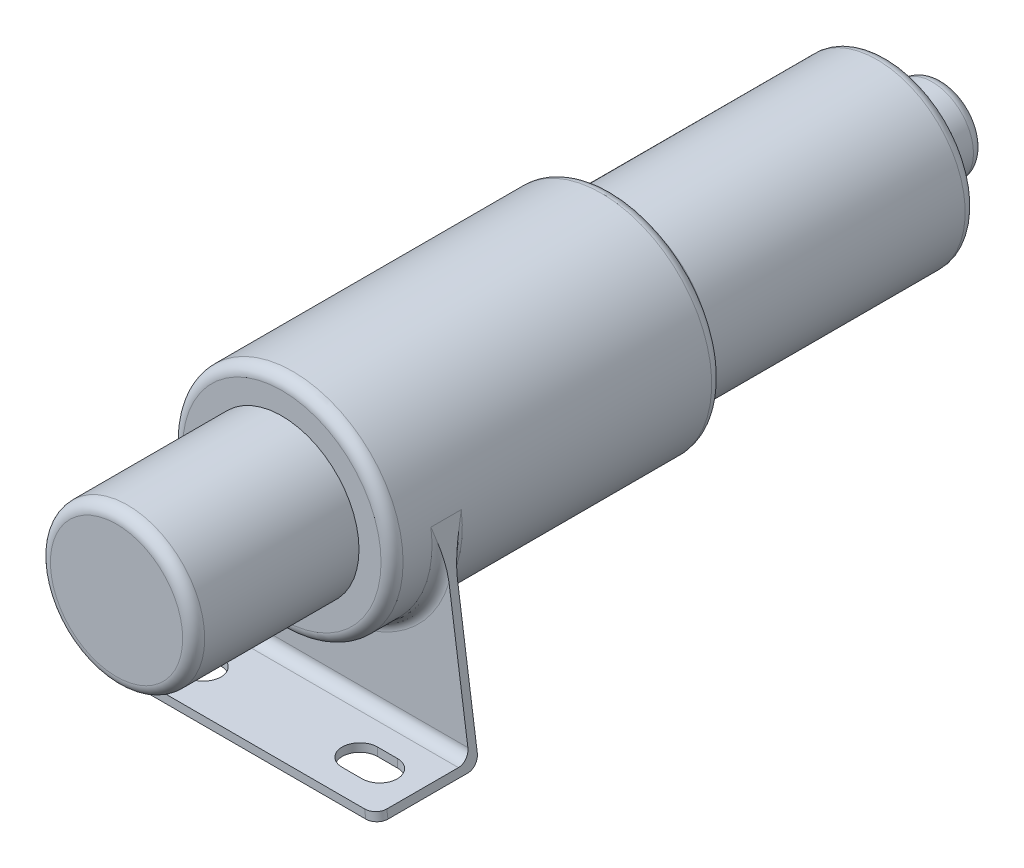
ISO-10303-21;
HEADER;
FILE_DESCRIPTION(('STEP AP214'),'2;1');
FILE_NAME('part.step','',(''),(''),'','','');
FILE_SCHEMA(('AUTOMOTIVE_DESIGN { 1 0 10303 214 1 1 1 1 }'));
ENDSEC;
DATA;
#1=APPLICATION_CONTEXT('core data for automotive mechanical design processes');
#2=APPLICATION_PROTOCOL_DEFINITION('international standard','automotive_design',2000,#1);
#3=PRODUCT_CONTEXT('',#1,'mechanical');
#4=PRODUCT('Part','Part','',(#3));
#5=PRODUCT_RELATED_PRODUCT_CATEGORY('part','',(#4));
#6=PRODUCT_DEFINITION_FORMATION('','',#4);
#7=PRODUCT_DEFINITION_CONTEXT('part definition',#1,'design');
#8=PRODUCT_DEFINITION('design','',#6,#7);
#9=PRODUCT_DEFINITION_SHAPE('','',#8);
#10=(LENGTH_UNIT() NAMED_UNIT(*) SI_UNIT(.MILLI.,.METRE.));
#11=(NAMED_UNIT(*) PLANE_ANGLE_UNIT() SI_UNIT($,.RADIAN.));
#12=(NAMED_UNIT(*) SI_UNIT($,.STERADIAN.) SOLID_ANGLE_UNIT());
#13=UNCERTAINTY_MEASURE_WITH_UNIT(LENGTH_MEASURE(1.E-05),#10,'distance_accuracy_value','');
#14=(GEOMETRIC_REPRESENTATION_CONTEXT(3) GLOBAL_UNCERTAINTY_ASSIGNED_CONTEXT((#13)) GLOBAL_UNIT_ASSIGNED_CONTEXT((#10,
#11,#12)) REPRESENTATION_CONTEXT('',''));
#15=CARTESIAN_POINT('',(0.,0.,0.));
#16=DIRECTION('',(0.,0.,1.));
#17=DIRECTION('',(1.,0.,0.));
#18=AXIS2_PLACEMENT_3D('',#15,#16,#17);
#19=CARTESIAN_POINT('',(0.,0.,75.));
#20=DIRECTION('',(0.,0.,-1.));
#21=DIRECTION('',(-1.,0.,0.));
#22=AXIS2_PLACEMENT_3D('',#19,#20,#21);
#23=CYLINDRICAL_SURFACE('',#22,20.);
#24=CARTESIAN_POINT('',(0.,0.,43.));
#25=DIRECTION('',(0.,0.,1.));
#26=DIRECTION('',(1.,0.,0.));
#27=AXIS2_PLACEMENT_3D('',#24,#25,#26);
#28=CIRCLE('',#27,20.);
#29=CARTESIAN_POINT('',(20.,0.,43.));
#30=VERTEX_POINT('',#29);
#31=EDGE_CURVE('E293',#30,#30,#28,.F.);
#32=ORIENTED_EDGE('',*,*,#31,.T.);
#33=EDGE_LOOP('',(#32));
#34=FACE_BOUND('',#33,.T.);
#35=CARTESIAN_POINT('',(0.,0.,-13.));
#36=DIRECTION('',(0.,0.,-1.));
#37=DIRECTION('',(-1.,0.,0.));
#38=AXIS2_PLACEMENT_3D('',#35,#36,#37);
#39=CIRCLE('',#38,20.);
#40=CARTESIAN_POINT('',(-20.,0.,-13.));
#41=VERTEX_POINT('',#40);
#42=EDGE_CURVE('E290',#41,#41,#39,.F.);
#43=ORIENTED_EDGE('',*,*,#42,.T.);
#44=EDGE_LOOP('',(#43));
#45=FACE_BOUND('',#44,.T.);
#46=CARTESIAN_POINT('',(0.,0.,32.25));
#47=DIRECTION('',(0.,0.,1.));
#48=DIRECTION('',(1.,0.,0.));
#49=AXIS2_PLACEMENT_3D('',#46,#47,#48);
#50=CIRCLE('',#49,20.);
#51=CARTESIAN_POINT('',(19.8034978548256,2.79668959913647,32.25));
#52=VERTEX_POINT('',#51);
#53=CARTESIAN_POINT('',(-19.8034978548256,2.79668959913647,32.25));
#54=VERTEX_POINT('',#53);
#55=EDGE_CURVE('E299',#52,#54,#50,.F.);
#56=ORIENTED_EDGE('',*,*,#55,.T.);
#57=DIRECTION('',(0.,0.,1.));
#58=VECTOR('',#57,1.);
#59=CARTESIAN_POINT('',(-19.8034978548256,2.79668959913647,34.25));
#60=LINE('',#59,#58);
#61=CARTESIAN_POINT('',(-19.8034978548256,2.79668959913647,37.75));
#62=VERTEX_POINT('',#61);
#63=EDGE_CURVE('E267',#54,#62,#60,.T.);
#64=ORIENTED_EDGE('',*,*,#63,.T.);
#65=CARTESIAN_POINT('',(0.,0.,37.75));
#66=DIRECTION('',(0.,0.,1.));
#67=DIRECTION('',(1.,0.,0.));
#68=AXIS2_PLACEMENT_3D('',#65,#66,#67);
#69=CIRCLE('',#68,20.);
#70=CARTESIAN_POINT('',(19.8034978548256,2.79668959913647,37.75));
#71=VERTEX_POINT('',#70);
#72=EDGE_CURVE('E296',#62,#71,#69,.T.);
#73=ORIENTED_EDGE('',*,*,#72,.T.);
#74=DIRECTION('',(0.,0.,1.));
#75=VECTOR('',#74,1.);
#76=CARTESIAN_POINT('',(19.8034978548256,2.79668959913647,34.25));
#77=LINE('',#76,#75);
#78=EDGE_CURVE('E272',#52,#71,#77,.T.);
#79=ORIENTED_EDGE('',*,*,#78,.F.);
#80=EDGE_LOOP('',(#56,#64,#73,#79));
#81=FACE_BOUND('',#80,.T.);
#82=ADVANCED_FACE('F39',(#34,#45,#81),#23,.T.);
#83=CARTESIAN_POINT('',(0.,0.,35.75));
#84=DIRECTION('',(0.,0.,1.));
#85=DIRECTION('',(1.,0.,0.));
#86=AXIS2_PLACEMENT_3D('',#83,#84,#85);
#87=PLANE('',#86);
#88=DIRECTION('',(-0.139834479956823,0.99017489274128,0.));
#89=VECTOR('',#88,1.);
#90=CARTESIAN_POINT('',(19.8034978548256,2.79668959913647,35.75));
#91=LINE('',#90,#89);
#92=CARTESIAN_POINT('',(24.505722995567,-30.5,35.75));
#93=VERTEX_POINT('',#92);
#94=CARTESIAN_POINT('',(21.0851020331594,-6.27841319532692,35.75));
#95=VERTEX_POINT('',#94);
#96=EDGE_CURVE('E264',#93,#95,#91,.T.);
#97=ORIENTED_EDGE('',*,*,#96,.T.);
#98=CARTESIAN_POINT('',(0.,0.,35.75));
#99=DIRECTION('',(0.,0.,1.));
#100=DIRECTION('',(1.,0.,0.));
#101=AXIS2_PLACEMENT_3D('',#98,#99,#100);
#102=CIRCLE('',#101,22.);
#103=CARTESIAN_POINT('',(-21.0851020331594,-6.27841319532692,35.75));
#104=VERTEX_POINT('',#103);
#105=EDGE_CURVE('E308',#95,#104,#102,.F.);
#106=ORIENTED_EDGE('',*,*,#105,.T.);
#107=DIRECTION('',(-0.139834479956823,-0.99017489274128,0.));
#108=VECTOR('',#107,1.);
#109=CARTESIAN_POINT('',(-19.8034978548256,2.79668959913647,35.75));
#110=LINE('',#109,#108);
#111=CARTESIAN_POINT('',(-24.505722995567,-30.5,35.75));
#112=VERTEX_POINT('',#111);
#113=EDGE_CURVE('E259',#104,#112,#110,.T.);
#114=ORIENTED_EDGE('',*,*,#113,.T.);
#115=DIRECTION('',(-1.,0.,0.));
#116=VECTOR('',#115,1.);
#117=CARTESIAN_POINT('',(0.,-30.5,35.75));
#118=LINE('',#117,#116);
#119=EDGE_CURVE('E306',#112,#93,#118,.F.);
#120=ORIENTED_EDGE('',*,*,#119,.T.);
#121=EDGE_LOOP('',(#97,#106,#114,#120));
#122=FACE_BOUND('',#121,.T.);
#123=ADVANCED_FACE('F414',(#122),#87,.T.);
#124=CARTESIAN_POINT('',(0.,0.,45.));
#125=DIRECTION('',(0.,0.,1.));
#126=DIRECTION('',(1.,0.,0.));
#127=AXIS2_PLACEMENT_3D('',#124,#125,#126);
#128=PLANE('',#127);
#129=CARTESIAN_POINT('',(0.,0.,45.));
#130=DIRECTION('',(0.,0.,1.));
#131=DIRECTION('',(1.,0.,0.));
#132=AXIS2_PLACEMENT_3D('',#129,#130,#131);
#133=CIRCLE('',#132,18.);
#134=CARTESIAN_POINT('',(18.,0.,45.));
#135=VERTEX_POINT('',#134);
#136=EDGE_CURVE('E336',#135,#135,#133,.T.);
#137=ORIENTED_EDGE('',*,*,#136,.T.);
#138=EDGE_LOOP('',(#137));
#139=FACE_BOUND('',#138,.T.);
#140=CARTESIAN_POINT('',(0.,0.,45.));
#141=DIRECTION('',(0.,0.,1.));
#142=DIRECTION('',(1.,0.,0.));
#143=AXIS2_PLACEMENT_3D('',#140,#141,#142);
#144=CIRCLE('',#143,14.);
#145=CARTESIAN_POINT('',(14.,0.,45.));
#146=VERTEX_POINT('',#145);
#147=EDGE_CURVE('E274',#146,#146,#144,.T.);
#148=ORIENTED_EDGE('',*,*,#147,.F.);
#149=EDGE_LOOP('',(#148));
#150=FACE_BOUND('',#149,.T.);
#151=ADVANCED_FACE('F429',(#139,#150),#128,.T.);
#152=CARTESIAN_POINT('',(0.,0.,45.));
#153=DIRECTION('',(0.,0.,1.));
#154=DIRECTION('',(1.,0.,0.));
#155=AXIS2_PLACEMENT_3D('',#152,#153,#154);
#156=CYLINDRICAL_SURFACE('',#155,14.);
#157=CARTESIAN_POINT('',(0.,0.,73.));
#158=DIRECTION('',(0.,0.,1.));
#159=DIRECTION('',(1.,0.,0.));
#160=AXIS2_PLACEMENT_3D('',#157,#158,#159);
#161=CIRCLE('',#160,14.);
#162=CARTESIAN_POINT('',(14.,0.,73.));
#163=VERTEX_POINT('',#162);
#164=EDGE_CURVE('E287',#163,#163,#161,.F.);
#165=ORIENTED_EDGE('',*,*,#164,.T.);
#166=EDGE_LOOP('',(#165));
#167=FACE_BOUND('',#166,.T.);
#168=ORIENTED_EDGE('',*,*,#147,.T.);
#169=EDGE_LOOP('',(#168));
#170=FACE_BOUND('',#169,.T.);
#171=ADVANCED_FACE('F440',(#167,#170),#156,.T.);
#172=CARTESIAN_POINT('',(0.,0.,75.));
#173=DIRECTION('',(0.,0.,1.));
#174=DIRECTION('',(1.,0.,0.));
#175=AXIS2_PLACEMENT_3D('',#172,#173,#174);
#176=PLANE('',#175);
#177=CARTESIAN_POINT('',(0.,0.,75.));
#178=DIRECTION('',(0.,0.,1.));
#179=DIRECTION('',(1.,0.,0.));
#180=AXIS2_PLACEMENT_3D('',#177,#178,#179);
#181=CIRCLE('',#180,12.);
#182=CARTESIAN_POINT('',(12.,0.,75.));
#183=VERTEX_POINT('',#182);
#184=EDGE_CURVE('E284',#183,#183,#181,.T.);
#185=ORIENTED_EDGE('',*,*,#184,.T.);
#186=EDGE_LOOP('',(#185));
#187=FACE_BOUND('',#186,.T.);
#188=ADVANCED_FACE('F412',(#187),#176,.T.);
#189=CARTESIAN_POINT('',(19.8034978548256,2.79668959913647,34.25));
#190=DIRECTION('',(0.99017489274128,0.139834479956823,0.));
#191=DIRECTION('',(-0.139834479956823,0.99017489274128,0.));
#192=AXIS2_PLACEMENT_3D('',#189,#190,#191);
#193=PLANE('',#192);
#194=DIRECTION('',(0.,0.,1.));
#195=VECTOR('',#194,1.);
#196=CARTESIAN_POINT('',(25.,-34.,34.25));
#197=LINE('',#196,#195);
#198=CARTESIAN_POINT('',(25.,-34.,36.25));
#199=VERTEX_POINT('',#198);
#200=CARTESIAN_POINT('',(25.,-34.,50.75));
#201=VERTEX_POINT('',#200);
#202=EDGE_CURVE('E275',#199,#201,#197,.T.);
#203=ORIENTED_EDGE('',*,*,#202,.F.);
#204=CARTESIAN_POINT('',(24.7175559974669,-32.,36.25));
#205=DIRECTION('',(0.99017489274128,0.139834479956823,0.));
#206=DIRECTION('',(-0.139834479956823,0.99017489274128,0.));
#207=AXIS2_PLACEMENT_3D('',#204,#205,#206);
#208=ELLIPSE('',#207,2.0198451956937,2.);
#209=CARTESIAN_POINT('',(24.7175559974669,-32.,34.25));
#210=VERTEX_POINT('',#209);
#211=EDGE_CURVE('E320',#199,#210,#208,.T.);
#212=ORIENTED_EDGE('',*,*,#211,.T.);
#213=DIRECTION('',(-0.139834479956823,0.99017489274128,0.));
#214=VECTOR('',#213,1.);
#215=CARTESIAN_POINT('',(19.8034978548256,2.79668959913647,34.25));
#216=LINE('',#215,#214);
#217=CARTESIAN_POINT('',(21.0851020331594,-6.27841319532692,34.25));
#218=VERTEX_POINT('',#217);
#219=EDGE_CURVE('E263',#210,#218,#216,.T.);
#220=ORIENTED_EDGE('',*,*,#219,.T.);
#221=CARTESIAN_POINT('',(21.0851020331595,-6.27841319532692,34.25));
#222=CARTESIAN_POINT('',(21.0614469380755,-6.11091029300459,34.2499729997001));
#223=CARTESIAN_POINT('',(21.0377968763078,-5.94344303184393,34.2462763573336));
#224=CARTESIAN_POINT('',(20.9905423514377,-5.60883139593561,34.2323570233018));
#225=CARTESIAN_POINT('',(20.9669378747328,-5.44168692486708,34.2221367395415));
#226=CARTESIAN_POINT('',(20.9198318154485,-5.10812658114009,34.1960039183706));
#227=CARTESIAN_POINT('',(20.8963301269804,-4.94170995867766,34.1801008885507));
#228=CARTESIAN_POINT('',(20.8494028226245,-4.60941538747097,34.1432473207556));
#229=CARTESIAN_POINT('',(20.8259772148835,-4.44353749641365,34.1222962592003));
#230=CARTESIAN_POINT('',(20.7561100180994,-3.94880440838519,34.0530275118771));
#231=CARTESIAN_POINT('',(20.7097952126454,-3.62084697230123,33.9981227378503));
#232=CARTESIAN_POINT('',(20.6175168163215,-2.96741906803518,33.8743949838894));
#233=CARTESIAN_POINT('',(20.5715534119472,-2.6419499204372,33.8055650826625));
#234=CARTESIAN_POINT('',(20.4650530812598,-1.88781579308973,33.6328054875952));
#235=CARTESIAN_POINT('',(20.4046481189218,-1.460085256798,33.5247470379304));
#236=CARTESIAN_POINT('',(20.2843352860557,-0.608144115990681,33.2952243848944));
#237=CARTESIAN_POINT('',(20.2244275171678,-0.183934231195236,33.1737575096745));
#238=CARTESIAN_POINT('',(20.0450735376402,1.08608019941085,32.7962493124458));
#239=CARTESIAN_POINT('',(19.9261627835343,1.92809315093056,32.5273991714335));
#240=CARTESIAN_POINT('',(19.806011890775,2.77888758580355,32.2556853351513));
#241=CARTESIAN_POINT('',(19.8047548722683,2.78778859623721,32.2528426586804));
#242=CARTESIAN_POINT('',(19.8034978548256,2.79668959913647,32.25));
#243=B_SPLINE_CURVE_WITH_KNOTS('',3,(#221,#222,#223,#224,#225,#226,#227,#228,#229,#230,#231,
#232,#233,#234,#235,#236,#237,#238,#239,#240,#241,#242),.UNSPECIFIED.,.F.,.F.,(4,2,2,2,2,2,2,2,
2,2,4),(0.,0.507403542069386,1.01461990746108,1.52099161098803,2.02741585785029,3.0341830537536,
4.0414518842608,5.37696765157115,6.71275002434702,9.38798628326188,9.41627055450936),.UNSPECIFIED.);
#244=EDGE_CURVE('E368',#218,#52,#243,.T.);
#245=ORIENTED_EDGE('',*,*,#244,.T.);
#246=ORIENTED_EDGE('',*,*,#78,.T.);
#247=CARTESIAN_POINT('',(21.0851020331595,-6.27841319532692,35.75));
#248=CARTESIAN_POINT('',(21.0614469380755,-6.11091029300459,35.7500270002999));
#249=CARTESIAN_POINT('',(21.0377968763078,-5.94344303184393,35.7537236426664));
#250=CARTESIAN_POINT('',(20.9905423514377,-5.60883139593561,35.7676429766982));
#251=CARTESIAN_POINT('',(20.9669378747328,-5.44168692486708,35.7778632604585));
#252=CARTESIAN_POINT('',(20.9198318154485,-5.10812658114009,35.8039960816294));
#253=CARTESIAN_POINT('',(20.8963301269804,-4.94170995867766,35.8198991114493));
#254=CARTESIAN_POINT('',(20.8494028226245,-4.60941538747097,35.8567526792444));
#255=CARTESIAN_POINT('',(20.8259772148835,-4.44353749641365,35.8777037407997));
#256=CARTESIAN_POINT('',(20.7561100180994,-3.94880440838519,35.9469724881229));
#257=CARTESIAN_POINT('',(20.7097952126454,-3.62084697230123,36.0018772621497));
#258=CARTESIAN_POINT('',(20.6175168163215,-2.96741906803518,36.1256050161106));
#259=CARTESIAN_POINT('',(20.5715534119472,-2.6419499204372,36.1944349173375));
#260=CARTESIAN_POINT('',(20.4650530812598,-1.88781579308973,36.3671945124048));
#261=CARTESIAN_POINT('',(20.4046481189218,-1.46008525679801,36.4752529620696));
#262=CARTESIAN_POINT('',(20.2843352860557,-0.608144115990683,36.7047756151056));
#263=CARTESIAN_POINT('',(20.2244275171678,-0.183934231195239,36.8262424903255));
#264=CARTESIAN_POINT('',(20.0450735376402,1.08608019941084,37.2037506875542));
#265=CARTESIAN_POINT('',(19.9261627835343,1.92809315093056,37.4726008285665));
#266=CARTESIAN_POINT('',(19.806011890775,2.77888758580355,37.7443146648487));
#267=CARTESIAN_POINT('',(19.8047548722683,2.78778859623721,37.7471573413196));
#268=CARTESIAN_POINT('',(19.8034978548256,2.79668959913647,37.75));
#269=B_SPLINE_CURVE_WITH_KNOTS('',3,(#247,#248,#249,#250,#251,#252,#253,#254,#255,#256,#257,
#258,#259,#260,#261,#262,#263,#264,#265,#266,#267,#268),.UNSPECIFIED.,.F.,.F.,(4,2,2,2,2,2,2,2,
2,2,4),(0.,0.507403542069386,1.01461990746108,1.52099161098803,2.02741585785029,3.0341830537536,
4.0414518842608,5.37696765157115,6.71275002434702,9.38798628326188,9.41627055450936),.UNSPECIFIED.);
#270=EDGE_CURVE('E402',#71,#95,#269,.F.);
#271=ORIENTED_EDGE('',*,*,#270,.T.);
#272=ORIENTED_EDGE('',*,*,#96,.F.);
#273=CARTESIAN_POINT('',(24.5057229955671,-30.5,37.75));
#274=DIRECTION('',(0.99017489274128,0.139834479956823,0.));
#275=DIRECTION('',(-0.139834479956823,0.99017489274128,0.));
#276=AXIS2_PLACEMENT_3D('',#273,#274,#275);
#277=ELLIPSE('',#276,2.0198451956937,2.);
#278=CARTESIAN_POINT('',(24.7881669981002,-32.5,37.75));
#279=VERTEX_POINT('',#278);
#280=EDGE_CURVE('E11',#93,#279,#277,.F.);
#281=ORIENTED_EDGE('',*,*,#280,.T.);
#282=DIRECTION('',(0.,0.,-1.));
#283=VECTOR('',#282,1.);
#284=CARTESIAN_POINT('',(24.7881669981002,-32.5,52.75));
#285=LINE('',#284,#283);
#286=CARTESIAN_POINT('',(24.7881669981002,-32.5,50.75));
#287=VERTEX_POINT('',#286);
#288=EDGE_CURVE('E256',#287,#279,#285,.T.);
#289=ORIENTED_EDGE('',*,*,#288,.F.);
#290=DIRECTION('',(-0.139834479956823,0.99017489274128,0.));
#291=VECTOR('',#290,1.);
#292=CARTESIAN_POINT('',(25.,-34.,50.75));
#293=LINE('',#292,#291);
#294=EDGE_CURVE('E318',#287,#201,#293,.F.);
#295=ORIENTED_EDGE('',*,*,#294,.T.);
#296=EDGE_LOOP('',(#203,#212,#220,#245,#246,#271,#272,#281,#289,#295));
#297=FACE_BOUND('',#296,.T.);
#298=ADVANCED_FACE('F408',(#297),#193,.T.);
#299=CARTESIAN_POINT('',(25.,-34.,34.25));
#300=DIRECTION('',(0.,-1.,0.));
#301=DIRECTION('',(0.,0.,-1.));
#302=AXIS2_PLACEMENT_3D('',#299,#300,#301);
#303=PLANE('',#302);
#304=DIRECTION('',(1.,0.,0.));
#305=VECTOR('',#304,1.);
#306=CARTESIAN_POINT('',(-17.8,-34.,41.85));
#307=LINE('',#306,#305);
#308=CARTESIAN_POINT('',(-17.8,-34.,41.85));
#309=VERTEX_POINT('',#308);
#310=CARTESIAN_POINT('',(-14.2,-34.,41.85));
#311=VERTEX_POINT('',#310);
#312=EDGE_CURVE('E183',#309,#311,#307,.T.);
#313=ORIENTED_EDGE('',*,*,#312,.F.);
#314=CARTESIAN_POINT('',(-17.8,-34.,45.05));
#315=DIRECTION('',(0.,-1.,0.));
#316=DIRECTION('',(0.,0.,-1.));
#317=AXIS2_PLACEMENT_3D('',#314,#315,#316);
#318=CIRCLE('',#317,3.2);
#319=CARTESIAN_POINT('',(-17.8,-34.,48.25));
#320=VERTEX_POINT('',#319);
#321=EDGE_CURVE('E195',#320,#309,#318,.T.);
#322=ORIENTED_EDGE('',*,*,#321,.F.);
#323=DIRECTION('',(-1.,0.,0.));
#324=VECTOR('',#323,1.);
#325=CARTESIAN_POINT('',(-17.8,-34.,48.25));
#326=LINE('',#325,#324);
#327=CARTESIAN_POINT('',(-14.2,-34.,48.25));
#328=VERTEX_POINT('',#327);
#329=EDGE_CURVE('E191',#328,#320,#326,.T.);
#330=ORIENTED_EDGE('',*,*,#329,.F.);
#331=CARTESIAN_POINT('',(-14.2,-34.,45.05));
#332=DIRECTION('',(0.,-1.,0.));
#333=DIRECTION('',(0.,0.,-1.));
#334=AXIS2_PLACEMENT_3D('',#331,#332,#333);
#335=CIRCLE('',#334,3.2);
#336=EDGE_CURVE('E205',#311,#328,#335,.T.);
#337=ORIENTED_EDGE('',*,*,#336,.F.);
#338=EDGE_LOOP('',(#313,#322,#330,#337));
#339=FACE_BOUND('',#338,.T.);
#340=CARTESIAN_POINT('',(17.8,-34.,45.05));
#341=DIRECTION('',(0.,-1.,0.));
#342=DIRECTION('',(0.,0.,1.));
#343=AXIS2_PLACEMENT_3D('',#340,#341,#342);
#344=CIRCLE('',#343,3.2);
#345=CARTESIAN_POINT('',(17.8,-34.,41.85));
#346=VERTEX_POINT('',#345);
#347=CARTESIAN_POINT('',(17.8,-34.,48.25));
#348=VERTEX_POINT('',#347);
#349=EDGE_CURVE('E232',#346,#348,#344,.T.);
#350=ORIENTED_EDGE('',*,*,#349,.F.);
#351=DIRECTION('',(1.,0.,0.));
#352=VECTOR('',#351,1.);
#353=CARTESIAN_POINT('',(17.8,-34.,41.85));
#354=LINE('',#353,#352);
#355=CARTESIAN_POINT('',(14.2,-34.,41.85));
#356=VERTEX_POINT('',#355);
#357=EDGE_CURVE('E240',#356,#346,#354,.T.);
#358=ORIENTED_EDGE('',*,*,#357,.F.);
#359=CARTESIAN_POINT('',(14.2,-34.,45.05));
#360=DIRECTION('',(0.,-1.,0.));
#361=DIRECTION('',(0.,0.,1.));
#362=AXIS2_PLACEMENT_3D('',#359,#360,#361);
#363=CIRCLE('',#362,3.2);
#364=CARTESIAN_POINT('',(14.2,-34.,48.25));
#365=VERTEX_POINT('',#364);
#366=EDGE_CURVE('E237',#365,#356,#363,.T.);
#367=ORIENTED_EDGE('',*,*,#366,.F.);
#368=DIRECTION('',(-1.,0.,0.));
#369=VECTOR('',#368,1.);
#370=CARTESIAN_POINT('',(17.8,-34.,48.25));
#371=LINE('',#370,#369);
#372=EDGE_CURVE('E234',#348,#365,#371,.T.);
#373=ORIENTED_EDGE('',*,*,#372,.F.);
#374=EDGE_LOOP('',(#350,#358,#367,#373));
#375=FACE_BOUND('',#374,.T.);
#376=DIRECTION('',(0.,0.,1.));
#377=VECTOR('',#376,1.);
#378=CARTESIAN_POINT('',(-25.,-34.,34.25));
#379=LINE('',#378,#377);
#380=CARTESIAN_POINT('',(-25.,-34.,36.25));
#381=VERTEX_POINT('',#380);
#382=CARTESIAN_POINT('',(-25.,-34.,50.75));
#383=VERTEX_POINT('',#382);
#384=EDGE_CURVE('E278',#381,#383,#379,.T.);
#385=ORIENTED_EDGE('',*,*,#384,.F.);
#386=DIRECTION('',(1.,0.,0.));
#387=VECTOR('',#386,1.);
#388=CARTESIAN_POINT('',(25.,-34.,36.25));
#389=LINE('',#388,#387);
#390=EDGE_CURVE('E315',#381,#199,#389,.T.);
#391=ORIENTED_EDGE('',*,*,#390,.T.);
#392=ORIENTED_EDGE('',*,*,#202,.T.);
#393=CARTESIAN_POINT('',(22.9801548043063,-34.,50.75));
#394=DIRECTION('',(0.,-1.,0.));
#395=DIRECTION('',(1.,0.,0.));
#396=AXIS2_PLACEMENT_3D('',#393,#394,#395);
#397=ELLIPSE('',#396,2.0198451956937,2.);
#398=CARTESIAN_POINT('',(22.9801548043063,-34.,52.75));
#399=VERTEX_POINT('',#398);
#400=EDGE_CURVE('E311',#201,#399,#397,.T.);
#401=ORIENTED_EDGE('',*,*,#400,.T.);
#402=DIRECTION('',(1.,0.,0.));
#403=VECTOR('',#402,1.);
#404=CARTESIAN_POINT('',(25.,-34.,52.75));
#405=LINE('',#404,#403);
#406=CARTESIAN_POINT('',(-22.9801548043063,-34.,52.75));
#407=VERTEX_POINT('',#406);
#408=EDGE_CURVE('E216',#407,#399,#405,.T.);
#409=ORIENTED_EDGE('',*,*,#408,.F.);
#410=CARTESIAN_POINT('',(-22.9801548043063,-34.,50.75));
#411=DIRECTION('',(0.,-1.,0.));
#412=DIRECTION('',(1.,0.,0.));
#413=AXIS2_PLACEMENT_3D('',#410,#411,#412);
#414=ELLIPSE('',#413,2.0198451956937,2.);
#415=EDGE_CURVE('E313',#407,#383,#414,.T.);
#416=ORIENTED_EDGE('',*,*,#415,.T.);
#417=EDGE_LOOP('',(#385,#391,#392,#401,#409,#416));
#418=FACE_BOUND('',#417,.T.);
#419=ADVANCED_FACE('F202',(#339,#375,#418),#303,.T.);
#420=CARTESIAN_POINT('',(-19.8034978548256,2.79668959913647,34.25));
#421=DIRECTION('',(-0.99017489274128,0.139834479956823,0.));
#422=DIRECTION('',(-0.139834479956823,-0.99017489274128,0.));
#423=AXIS2_PLACEMENT_3D('',#420,#421,#422);
#424=PLANE('',#423);
#425=DIRECTION('',(-0.139834479956823,-0.99017489274128,0.));
#426=VECTOR('',#425,1.);
#427=CARTESIAN_POINT('',(-19.8034978548256,2.79668959913647,34.25));
#428=LINE('',#427,#426);
#429=CARTESIAN_POINT('',(-21.0851020331594,-6.27841319532692,34.25));
#430=VERTEX_POINT('',#429);
#431=CARTESIAN_POINT('',(-24.7175559974669,-32.,34.25));
#432=VERTEX_POINT('',#431);
#433=EDGE_CURVE('E260',#430,#432,#428,.T.);
#434=ORIENTED_EDGE('',*,*,#433,.T.);
#435=CARTESIAN_POINT('',(-24.7175559974669,-32.,36.25));
#436=DIRECTION('',(-0.99017489274128,0.139834479956823,0.));
#437=DIRECTION('',(-0.139834479956823,-0.99017489274128,0.));
#438=AXIS2_PLACEMENT_3D('',#435,#436,#437);
#439=ELLIPSE('',#438,2.0198451956937,2.);
#440=EDGE_CURVE('E324',#432,#381,#439,.T.);
#441=ORIENTED_EDGE('',*,*,#440,.T.);
#442=ORIENTED_EDGE('',*,*,#384,.T.);
#443=DIRECTION('',(-0.139834479956823,-0.99017489274128,0.));
#444=VECTOR('',#443,1.);
#445=CARTESIAN_POINT('',(-24.7881669981002,-32.5,50.75));
#446=LINE('',#445,#444);
#447=CARTESIAN_POINT('',(-24.7881669981002,-32.5,50.75));
#448=VERTEX_POINT('',#447);
#449=EDGE_CURVE('E322',#383,#448,#446,.F.);
#450=ORIENTED_EDGE('',*,*,#449,.T.);
#451=DIRECTION('',(0.,0.,-1.));
#452=VECTOR('',#451,1.);
#453=CARTESIAN_POINT('',(-24.7881669981002,-32.5,52.75));
#454=LINE('',#453,#452);
#455=CARTESIAN_POINT('',(-24.7881669981002,-32.5,37.75));
#456=VERTEX_POINT('',#455);
#457=EDGE_CURVE('E253',#448,#456,#454,.T.);
#458=ORIENTED_EDGE('',*,*,#457,.T.);
#459=CARTESIAN_POINT('',(-24.505722995567,-30.5,37.75));
#460=DIRECTION('',(-0.99017489274128,0.139834479956823,0.));
#461=DIRECTION('',(-0.139834479956823,-0.99017489274128,0.));
#462=AXIS2_PLACEMENT_3D('',#459,#460,#461);
#463=ELLIPSE('',#462,2.0198451956937,2.);
#464=EDGE_CURVE('E48',#456,#112,#463,.F.);
#465=ORIENTED_EDGE('',*,*,#464,.T.);
#466=ORIENTED_EDGE('',*,*,#113,.F.);
#467=CARTESIAN_POINT('',(-21.0851020331595,-6.27841319532692,35.75));
#468=CARTESIAN_POINT('',(-21.0614469380755,-6.11091029300459,35.7500270002999));
#469=CARTESIAN_POINT('',(-21.0377968763078,-5.94344303184393,35.7537236426664));
#470=CARTESIAN_POINT('',(-20.9905423514377,-5.60883139593561,35.7676429766982));
#471=CARTESIAN_POINT('',(-20.9669378747328,-5.44168692486708,35.7778632604585));
#472=CARTESIAN_POINT('',(-20.9198318154485,-5.10812658114009,35.8039960816294));
#473=CARTESIAN_POINT('',(-20.8963301269804,-4.94170995867766,35.8198991114493));
#474=CARTESIAN_POINT('',(-20.8494028226245,-4.60941538747097,35.8567526792444));
#475=CARTESIAN_POINT('',(-20.8259772148835,-4.44353749641365,35.8777037407997));
#476=CARTESIAN_POINT('',(-20.7561100180994,-3.94880440838519,35.9469724881229));
#477=CARTESIAN_POINT('',(-20.7097952126454,-3.62084697230123,36.0018772621497));
#478=CARTESIAN_POINT('',(-20.6175168163215,-2.96741906803518,36.1256050161106));
#479=CARTESIAN_POINT('',(-20.5715534119472,-2.6419499204372,36.1944349173375));
#480=CARTESIAN_POINT('',(-20.4650530812598,-1.88781579308973,36.3671945124048));
#481=CARTESIAN_POINT('',(-20.4046481189218,-1.46008525679801,36.4752529620696));
#482=CARTESIAN_POINT('',(-20.2843352860557,-0.608144115990683,36.7047756151056));
#483=CARTESIAN_POINT('',(-20.2244275171678,-0.183934231195239,36.8262424903255));
#484=CARTESIAN_POINT('',(-20.0450735376402,1.08608019941084,37.2037506875542));
#485=CARTESIAN_POINT('',(-19.9261627835343,1.92809315093056,37.4726008285665));
#486=CARTESIAN_POINT('',(-19.806011890775,2.77888758580355,37.7443146648487));
#487=CARTESIAN_POINT('',(-19.8047548722683,2.78778859623721,37.7471573413196));
#488=CARTESIAN_POINT('',(-19.8034978548256,2.79668959913647,37.75));
#489=B_SPLINE_CURVE_WITH_KNOTS('',3,(#467,#468,#469,#470,#471,#472,#473,#474,#475,#476,#477,
#478,#479,#480,#481,#482,#483,#484,#485,#486,#487,#488),.UNSPECIFIED.,.F.,.F.,(4,2,2,2,2,2,2,2,
2,2,4),(0.,0.507403542069386,1.01461990746108,1.52099161098803,2.02741585785029,3.0341830537536,
4.0414518842608,5.37696765157115,6.71275002434702,9.38798628326188,9.41627055450936),.UNSPECIFIED.);
#490=EDGE_CURVE('E396',#104,#62,#489,.T.);
#491=ORIENTED_EDGE('',*,*,#490,.T.);
#492=ORIENTED_EDGE('',*,*,#63,.F.);
#493=CARTESIAN_POINT('',(-21.0851020331595,-6.27841319532692,34.25));
#494=CARTESIAN_POINT('',(-21.0614469380755,-6.11091029300459,34.2499729997001));
#495=CARTESIAN_POINT('',(-21.0377968763078,-5.94344303184393,34.2462763573336));
#496=CARTESIAN_POINT('',(-20.9905423514377,-5.60883139593561,34.2323570233018));
#497=CARTESIAN_POINT('',(-20.9669378747328,-5.44168692486708,34.2221367395415));
#498=CARTESIAN_POINT('',(-20.9198318154485,-5.10812658114009,34.1960039183706));
#499=CARTESIAN_POINT('',(-20.8963301269804,-4.94170995867766,34.1801008885507));
#500=CARTESIAN_POINT('',(-20.8494028226245,-4.60941538747097,34.1432473207556));
#501=CARTESIAN_POINT('',(-20.8259772148835,-4.44353749641365,34.1222962592003));
#502=CARTESIAN_POINT('',(-20.7561100180994,-3.94880440838519,34.0530275118771));
#503=CARTESIAN_POINT('',(-20.7097952126454,-3.62084697230123,33.9981227378503));
#504=CARTESIAN_POINT('',(-20.6175168163215,-2.96741906803518,33.8743949838894));
#505=CARTESIAN_POINT('',(-20.5715534119472,-2.6419499204372,33.8055650826625));
#506=CARTESIAN_POINT('',(-20.4650530812598,-1.88781579308973,33.6328054875952));
#507=CARTESIAN_POINT('',(-20.4046481189218,-1.460085256798,33.5247470379304));
#508=CARTESIAN_POINT('',(-20.2843352860557,-0.608144115990681,33.2952243848944));
#509=CARTESIAN_POINT('',(-20.2244275171678,-0.183934231195236,33.1737575096745));
#510=CARTESIAN_POINT('',(-20.0450735376402,1.08608019941085,32.7962493124458));
#511=CARTESIAN_POINT('',(-19.9261627835343,1.92809315093056,32.5273991714335));
#512=CARTESIAN_POINT('',(-19.806011890775,2.77888758580355,32.2556853351513));
#513=CARTESIAN_POINT('',(-19.8047548722683,2.78778859623721,32.2528426586804));
#514=CARTESIAN_POINT('',(-19.8034978548256,2.79668959913647,32.25));
#515=B_SPLINE_CURVE_WITH_KNOTS('',3,(#493,#494,#495,#496,#497,#498,#499,#500,#501,#502,#503,
#504,#505,#506,#507,#508,#509,#510,#511,#512,#513,#514),.UNSPECIFIED.,.F.,.F.,(4,2,2,2,2,2,2,2,
2,2,4),(0.,0.507403542069386,1.01461990746108,1.52099161098803,2.02741585785029,3.0341830537536,
4.0414518842608,5.37696765157115,6.71275002434702,9.38798628326188,9.41627055450936),.UNSPECIFIED.);
#516=EDGE_CURVE('E360',#54,#430,#515,.F.);
#517=ORIENTED_EDGE('',*,*,#516,.T.);
#518=EDGE_LOOP('',(#434,#441,#442,#450,#458,#465,#466,#491,#492,#517));
#519=FACE_BOUND('',#518,.T.);
#520=ADVANCED_FACE('F375',(#519),#424,.T.);
#521=CARTESIAN_POINT('',(0.,0.,34.25));
#522=DIRECTION('',(0.,0.,1.));
#523=DIRECTION('',(1.,0.,0.));
#524=AXIS2_PLACEMENT_3D('',#521,#522,#523);
#525=PLANE('',#524);
#526=ORIENTED_EDGE('',*,*,#433,.F.);
#527=CARTESIAN_POINT('',(0.,0.,34.25));
#528=DIRECTION('',(0.,0.,1.));
#529=DIRECTION('',(1.,0.,0.));
#530=AXIS2_PLACEMENT_3D('',#527,#528,#529);
#531=CIRCLE('',#530,22.);
#532=EDGE_CURVE('E304',#430,#218,#531,.T.);
#533=ORIENTED_EDGE('',*,*,#532,.T.);
#534=ORIENTED_EDGE('',*,*,#219,.F.);
#535=DIRECTION('',(1.,0.,0.));
#536=VECTOR('',#535,1.);
#537=CARTESIAN_POINT('',(-25.,-32.,34.25));
#538=LINE('',#537,#536);
#539=EDGE_CURVE('E302',#210,#432,#538,.F.);
#540=ORIENTED_EDGE('',*,*,#539,.T.);
#541=EDGE_LOOP('',(#526,#533,#534,#540));
#542=FACE_BOUND('',#541,.T.);
#543=ADVANCED_FACE('F421',(#542),#525,.F.);
#544=CARTESIAN_POINT('',(-24.7881669981002,-32.5,52.75));
#545=DIRECTION('',(0.,-1.,0.));
#546=DIRECTION('',(0.,0.,-1.));
#547=AXIS2_PLACEMENT_3D('',#544,#545,#546);
#548=PLANE('',#547);
#549=CARTESIAN_POINT('',(-17.8,-32.5,45.05));
#550=DIRECTION('',(0.,-1.,0.));
#551=DIRECTION('',(0.,0.,-1.));
#552=AXIS2_PLACEMENT_3D('',#549,#550,#551);
#553=CIRCLE('',#552,3.2);
#554=CARTESIAN_POINT('',(-17.8,-32.5,41.85));
#555=VERTEX_POINT('',#554);
#556=CARTESIAN_POINT('',(-17.8,-32.5,48.25));
#557=VERTEX_POINT('',#556);
#558=EDGE_CURVE('E200',#555,#557,#553,.F.);
#559=ORIENTED_EDGE('',*,*,#558,.F.);
#560=DIRECTION('',(-1.,0.,0.));
#561=VECTOR('',#560,1.);
#562=CARTESIAN_POINT('',(-17.8,-32.5,41.85));
#563=LINE('',#562,#561);
#564=CARTESIAN_POINT('',(-14.2,-32.5,41.85));
#565=VERTEX_POINT('',#564);
#566=EDGE_CURVE('E186',#565,#555,#563,.T.);
#567=ORIENTED_EDGE('',*,*,#566,.F.);
#568=CARTESIAN_POINT('',(-14.2,-32.5,45.05));
#569=DIRECTION('',(0.,-1.,0.));
#570=DIRECTION('',(0.,0.,-1.));
#571=AXIS2_PLACEMENT_3D('',#568,#569,#570);
#572=CIRCLE('',#571,3.2);
#573=CARTESIAN_POINT('',(-14.2,-32.5,48.25));
#574=VERTEX_POINT('',#573);
#575=EDGE_CURVE('E246',#574,#565,#572,.F.);
#576=ORIENTED_EDGE('',*,*,#575,.F.);
#577=DIRECTION('',(1.,0.,0.));
#578=VECTOR('',#577,1.);
#579=CARTESIAN_POINT('',(-17.8,-32.5,48.25));
#580=LINE('',#579,#578);
#581=EDGE_CURVE('E789',#557,#574,#580,.T.);
#582=ORIENTED_EDGE('',*,*,#581,.F.);
#583=EDGE_LOOP('',(#559,#567,#576,#582));
#584=FACE_BOUND('',#583,.T.);
#585=DIRECTION('',(-1.,0.,0.));
#586=VECTOR('',#585,1.);
#587=CARTESIAN_POINT('',(17.8,-32.5,41.85));
#588=LINE('',#587,#586);
#589=CARTESIAN_POINT('',(17.8,-32.5,41.85));
#590=VERTEX_POINT('',#589);
#591=CARTESIAN_POINT('',(14.2,-32.5,41.85));
#592=VERTEX_POINT('',#591);
#593=EDGE_CURVE('E225',#590,#592,#588,.T.);
#594=ORIENTED_EDGE('',*,*,#593,.F.);
#595=CARTESIAN_POINT('',(17.8,-32.5,45.05));
#596=DIRECTION('',(0.,-1.,0.));
#597=DIRECTION('',(0.,0.,-1.));
#598=AXIS2_PLACEMENT_3D('',#595,#596,#597);
#599=CIRCLE('',#598,3.2);
#600=CARTESIAN_POINT('',(17.8,-32.5,48.25));
#601=VERTEX_POINT('',#600);
#602=EDGE_CURVE('E228',#601,#590,#599,.F.);
#603=ORIENTED_EDGE('',*,*,#602,.F.);
#604=DIRECTION('',(1.,0.,0.));
#605=VECTOR('',#604,1.);
#606=CARTESIAN_POINT('',(17.8,-32.5,48.25));
#607=LINE('',#606,#605);
#608=CARTESIAN_POINT('',(14.2,-32.5,48.25));
#609=VERTEX_POINT('',#608);
#610=EDGE_CURVE('E231',#609,#601,#607,.T.);
#611=ORIENTED_EDGE('',*,*,#610,.F.);
#612=CARTESIAN_POINT('',(14.2,-32.5,45.05));
#613=DIRECTION('',(0.,-1.,0.));
#614=DIRECTION('',(0.,0.,-1.));
#615=AXIS2_PLACEMENT_3D('',#612,#613,#614);
#616=CIRCLE('',#615,3.2);
#617=EDGE_CURVE('E223',#592,#609,#616,.F.);
#618=ORIENTED_EDGE('',*,*,#617,.F.);
#619=EDGE_LOOP('',(#594,#603,#611,#618));
#620=FACE_BOUND('',#619,.T.);
#621=ORIENTED_EDGE('',*,*,#288,.T.);
#622=DIRECTION('',(-1.,0.,0.));
#623=VECTOR('',#622,1.);
#624=CARTESIAN_POINT('',(-24.7881669981002,-32.5,37.75));
#625=LINE('',#624,#623);
#626=EDGE_CURVE('E328',#279,#456,#625,.T.);
#627=ORIENTED_EDGE('',*,*,#626,.T.);
#628=ORIENTED_EDGE('',*,*,#457,.F.);
#629=CARTESIAN_POINT('',(-22.7683218024065,-32.5,50.75));
#630=DIRECTION('',(0.,-1.,0.));
#631=DIRECTION('',(1.,0.,0.));
#632=AXIS2_PLACEMENT_3D('',#629,#630,#631);
#633=ELLIPSE('',#632,2.0198451956937,2.);
#634=CARTESIAN_POINT('',(-22.7683218024065,-32.5,52.75));
#635=VERTEX_POINT('',#634);
#636=EDGE_CURVE('E55',#448,#635,#633,.F.);
#637=ORIENTED_EDGE('',*,*,#636,.T.);
#638=DIRECTION('',(-1.,0.,0.));
#639=VECTOR('',#638,1.);
#640=CARTESIAN_POINT('',(-24.7881669981002,-32.5,52.75));
#641=LINE('',#640,#639);
#642=CARTESIAN_POINT('',(22.7683218024065,-32.5,52.75));
#643=VERTEX_POINT('',#642);
#644=EDGE_CURVE('E251',#643,#635,#641,.T.);
#645=ORIENTED_EDGE('',*,*,#644,.F.);
#646=CARTESIAN_POINT('',(22.7683218024065,-32.5,50.75));
#647=DIRECTION('',(0.,-1.,0.));
#648=DIRECTION('',(1.,0.,0.));
#649=AXIS2_PLACEMENT_3D('',#646,#647,#648);
#650=ELLIPSE('',#649,2.0198451956937,2.);
#651=EDGE_CURVE('E63',#643,#287,#650,.F.);
#652=ORIENTED_EDGE('',*,*,#651,.T.);
#653=EDGE_LOOP('',(#621,#627,#628,#637,#645,#652));
#654=FACE_BOUND('',#653,.T.);
#655=ADVANCED_FACE('F676',(#584,#620,#654),#548,.F.);
#656=CARTESIAN_POINT('',(0.,0.,52.75));
#657=DIRECTION('',(0.,0.,-1.));
#658=DIRECTION('',(-1.,0.,0.));
#659=AXIS2_PLACEMENT_3D('',#656,#657,#658);
#660=PLANE('',#659);
#661=ORIENTED_EDGE('',*,*,#644,.T.);
#662=DIRECTION('',(-0.139834479956823,-0.99017489274128,0.));
#663=VECTOR('',#662,1.);
#664=CARTESIAN_POINT('',(-23.0196502145174,-34.2796689599137,52.75));
#665=LINE('',#664,#663);
#666=EDGE_CURVE('E333',#635,#407,#665,.T.);
#667=ORIENTED_EDGE('',*,*,#666,.T.);
#668=ORIENTED_EDGE('',*,*,#408,.T.);
#669=DIRECTION('',(-0.139834479956823,0.99017489274128,0.));
#670=VECTOR('',#669,1.);
#671=CARTESIAN_POINT('',(22.8078172126176,-32.7796689599137,52.75));
#672=LINE('',#671,#670);
#673=EDGE_CURVE('E331',#399,#643,#672,.T.);
#674=ORIENTED_EDGE('',*,*,#673,.T.);
#675=EDGE_LOOP('',(#661,#667,#668,#674));
#676=FACE_BOUND('',#675,.T.);
#677=ADVANCED_FACE('F667',(#676),#660,.F.);
#678=CARTESIAN_POINT('',(17.8,20.001,45.05));
#679=DIRECTION('',(0.,-1.,0.));
#680=DIRECTION('',(0.,0.,-1.));
#681=AXIS2_PLACEMENT_3D('',#678,#679,#680);
#682=CYLINDRICAL_SURFACE('',#681,3.2);
#683=ORIENTED_EDGE('',*,*,#602,.T.);
#684=DIRECTION('',(0.,-1.,0.));
#685=VECTOR('',#684,1.);
#686=CARTESIAN_POINT('',(17.8,20.001,41.85));
#687=LINE('',#686,#685);
#688=EDGE_CURVE('E219',#590,#346,#687,.T.);
#689=ORIENTED_EDGE('',*,*,#688,.T.);
#690=ORIENTED_EDGE('',*,*,#349,.T.);
#691=DIRECTION('',(0.,-1.,0.));
#692=VECTOR('',#691,1.);
#693=CARTESIAN_POINT('',(17.8,20.001,48.25));
#694=LINE('',#693,#692);
#695=EDGE_CURVE('E222',#601,#348,#694,.T.);
#696=ORIENTED_EDGE('',*,*,#695,.F.);
#697=EDGE_LOOP('',(#683,#689,#690,#696));
#698=FACE_BOUND('',#697,.T.);
#699=ADVANCED_FACE('F658',(#698),#682,.F.);
#700=CARTESIAN_POINT('',(17.8,20.001,41.85));
#701=DIRECTION('',(0.,0.,-1.));
#702=DIRECTION('',(-1.,0.,0.));
#703=AXIS2_PLACEMENT_3D('',#700,#701,#702);
#704=PLANE('',#703);
#705=ORIENTED_EDGE('',*,*,#593,.T.);
#706=DIRECTION('',(0.,-1.,0.));
#707=VECTOR('',#706,1.);
#708=CARTESIAN_POINT('',(14.2,20.001,41.85));
#709=LINE('',#708,#707);
#710=EDGE_CURVE('E217',#592,#356,#709,.T.);
#711=ORIENTED_EDGE('',*,*,#710,.T.);
#712=ORIENTED_EDGE('',*,*,#357,.T.);
#713=ORIENTED_EDGE('',*,*,#688,.F.);
#714=EDGE_LOOP('',(#705,#711,#712,#713));
#715=FACE_BOUND('',#714,.T.);
#716=ADVANCED_FACE('F649',(#715),#704,.F.);
#717=CARTESIAN_POINT('',(14.2,20.001,45.05));
#718=DIRECTION('',(0.,-1.,0.));
#719=DIRECTION('',(0.,0.,-1.));
#720=AXIS2_PLACEMENT_3D('',#717,#718,#719);
#721=CYLINDRICAL_SURFACE('',#720,3.2);
#722=ORIENTED_EDGE('',*,*,#617,.T.);
#723=DIRECTION('',(0.,-1.,0.));
#724=VECTOR('',#723,1.);
#725=CARTESIAN_POINT('',(14.2,20.001,48.25));
#726=LINE('',#725,#724);
#727=EDGE_CURVE('E220',#609,#365,#726,.T.);
#728=ORIENTED_EDGE('',*,*,#727,.T.);
#729=ORIENTED_EDGE('',*,*,#366,.T.);
#730=ORIENTED_EDGE('',*,*,#710,.F.);
#731=EDGE_LOOP('',(#722,#728,#729,#730));
#732=FACE_BOUND('',#731,.T.);
#733=ADVANCED_FACE('F640',(#732),#721,.F.);
#734=CARTESIAN_POINT('',(17.8,20.001,48.25));
#735=DIRECTION('',(0.,0.,1.));
#736=DIRECTION('',(1.,0.,0.));
#737=AXIS2_PLACEMENT_3D('',#734,#735,#736);
#738=PLANE('',#737);
#739=ORIENTED_EDGE('',*,*,#610,.T.);
#740=ORIENTED_EDGE('',*,*,#695,.T.);
#741=ORIENTED_EDGE('',*,*,#372,.T.);
#742=ORIENTED_EDGE('',*,*,#727,.F.);
#743=EDGE_LOOP('',(#739,#740,#741,#742));
#744=FACE_BOUND('',#743,.T.);
#745=ADVANCED_FACE('F632',(#744),#738,.F.);
#746=CARTESIAN_POINT('',(-17.8,20.001,41.85));
#747=DIRECTION('',(0.,0.,-1.));
#748=DIRECTION('',(-1.,0.,0.));
#749=AXIS2_PLACEMENT_3D('',#746,#747,#748);
#750=PLANE('',#749);
#751=ORIENTED_EDGE('',*,*,#566,.T.);
#752=DIRECTION('',(0.,-1.,0.));
#753=VECTOR('',#752,1.);
#754=CARTESIAN_POINT('',(-17.8,20.001,41.85));
#755=LINE('',#754,#753);
#756=EDGE_CURVE('E179',#555,#309,#755,.T.);
#757=ORIENTED_EDGE('',*,*,#756,.T.);
#758=ORIENTED_EDGE('',*,*,#312,.T.);
#759=DIRECTION('',(0.,-1.,0.));
#760=VECTOR('',#759,1.);
#761=CARTESIAN_POINT('',(-14.2,20.001,41.85));
#762=LINE('',#761,#760);
#763=EDGE_CURVE('E190',#565,#311,#762,.T.);
#764=ORIENTED_EDGE('',*,*,#763,.F.);
#765=EDGE_LOOP('',(#751,#757,#758,#764));
#766=FACE_BOUND('',#765,.T.);
#767=ADVANCED_FACE('F181',(#766),#750,.F.);
#768=CARTESIAN_POINT('',(-14.2,20.001,45.05));
#769=DIRECTION('',(0.,-1.,0.));
#770=DIRECTION('',(0.,0.,-1.));
#771=AXIS2_PLACEMENT_3D('',#768,#769,#770);
#772=CYLINDRICAL_SURFACE('',#771,3.2);
#773=ORIENTED_EDGE('',*,*,#575,.T.);
#774=ORIENTED_EDGE('',*,*,#763,.T.);
#775=ORIENTED_EDGE('',*,*,#336,.T.);
#776=DIRECTION('',(0.,-1.,0.));
#777=VECTOR('',#776,1.);
#778=CARTESIAN_POINT('',(-14.2,20.001,48.25));
#779=LINE('',#778,#777);
#780=EDGE_CURVE('E212',#574,#328,#779,.T.);
#781=ORIENTED_EDGE('',*,*,#780,.F.);
#782=EDGE_LOOP('',(#773,#774,#775,#781));
#783=FACE_BOUND('',#782,.T.);
#784=ADVANCED_FACE('F615',(#783),#772,.F.);
#785=CARTESIAN_POINT('',(-17.8,20.001,48.25));
#786=DIRECTION('',(0.,0.,1.));
#787=DIRECTION('',(1.,0.,0.));
#788=AXIS2_PLACEMENT_3D('',#785,#786,#787);
#789=PLANE('',#788);
#790=ORIENTED_EDGE('',*,*,#581,.T.);
#791=ORIENTED_EDGE('',*,*,#780,.T.);
#792=ORIENTED_EDGE('',*,*,#329,.T.);
#793=DIRECTION('',(0.,-1.,0.));
#794=VECTOR('',#793,1.);
#795=CARTESIAN_POINT('',(-17.8,20.001,48.25));
#796=LINE('',#795,#794);
#797=EDGE_CURVE('E197',#557,#320,#796,.T.);
#798=ORIENTED_EDGE('',*,*,#797,.F.);
#799=EDGE_LOOP('',(#790,#791,#792,#798));
#800=FACE_BOUND('',#799,.T.);
#801=ADVANCED_FACE('F607',(#800),#789,.F.);
#802=CARTESIAN_POINT('',(-17.8,20.001,45.05));
#803=DIRECTION('',(0.,-1.,0.));
#804=DIRECTION('',(0.,0.,-1.));
#805=AXIS2_PLACEMENT_3D('',#802,#803,#804);
#806=CYLINDRICAL_SURFACE('',#805,3.2);
#807=ORIENTED_EDGE('',*,*,#558,.T.);
#808=ORIENTED_EDGE('',*,*,#797,.T.);
#809=ORIENTED_EDGE('',*,*,#321,.T.);
#810=ORIENTED_EDGE('',*,*,#756,.F.);
#811=EDGE_LOOP('',(#807,#808,#809,#810));
#812=FACE_BOUND('',#811,.T.);
#813=ADVANCED_FACE('F196',(#812),#806,.F.);
#814=CARTESIAN_POINT('',(0.,0.,45.));
#815=DIRECTION('',(0.,0.,1.));
#816=DIRECTION('',(1.,0.,0.));
#817=AXIS2_PLACEMENT_3D('',#814,#815,#816);
#818=CYLINDRICAL_SURFACE('',#817,7.5);
#819=CARTESIAN_POINT('',(0.,0.,-73.));
#820=DIRECTION('',(0.,0.,1.));
#821=DIRECTION('',(1.,0.,0.));
#822=AXIS2_PLACEMENT_3D('',#819,#820,#821);
#823=CIRCLE('',#822,7.5);
#824=CARTESIAN_POINT('',(7.5,0.,-73.));
#825=VERTEX_POINT('',#824);
#826=EDGE_CURVE('E342',#825,#825,#823,.T.);
#827=ORIENTED_EDGE('',*,*,#826,.T.);
#828=EDGE_LOOP('',(#827));
#829=FACE_BOUND('',#828,.T.);
#830=CARTESIAN_POINT('',(0.,0.,-67.));
#831=DIRECTION('',(0.,0.,-1.));
#832=DIRECTION('',(-1.,0.,0.));
#833=AXIS2_PLACEMENT_3D('',#830,#831,#832);
#834=CIRCLE('',#833,7.5);
#835=CARTESIAN_POINT('',(-7.5,0.,-67.));
#836=VERTEX_POINT('',#835);
#837=EDGE_CURVE('E339',#836,#836,#834,.T.);
#838=ORIENTED_EDGE('',*,*,#837,.T.);
#839=EDGE_LOOP('',(#838));
#840=FACE_BOUND('',#839,.T.);
#841=ADVANCED_FACE('F583',(#829,#840),#818,.T.);
#842=CARTESIAN_POINT('',(0.,16.,-65.));
#843=DIRECTION('',(0.,0.,-1.));
#844=DIRECTION('',(-1.,0.,0.));
#845=AXIS2_PLACEMENT_3D('',#842,#843,#844);
#846=PLANE('',#845);
#847=CARTESIAN_POINT('',(0.,0.,-65.));
#848=DIRECTION('',(0.,0.,-1.));
#849=DIRECTION('',(-1.,0.,0.));
#850=AXIS2_PLACEMENT_3D('',#847,#848,#849);
#851=CIRCLE('',#850,9.5);
#852=CARTESIAN_POINT('',(-9.5,0.,-65.));
#853=VERTEX_POINT('',#852);
#854=EDGE_CURVE('E351',#853,#853,#851,.F.);
#855=ORIENTED_EDGE('',*,*,#854,.T.);
#856=EDGE_LOOP('',(#855));
#857=FACE_BOUND('',#856,.T.);
#858=CARTESIAN_POINT('',(0.,0.,-65.));
#859=DIRECTION('',(0.,0.,-1.));
#860=DIRECTION('',(-1.,0.,0.));
#861=AXIS2_PLACEMENT_3D('',#858,#859,#860);
#862=CIRCLE('',#861,14.);
#863=CARTESIAN_POINT('',(-14.,0.,-65.));
#864=VERTEX_POINT('',#863);
#865=EDGE_CURVE('E348',#864,#864,#862,.T.);
#866=ORIENTED_EDGE('',*,*,#865,.T.);
#867=EDGE_LOOP('',(#866));
#868=FACE_BOUND('',#867,.T.);
#869=ADVANCED_FACE('F574',(#857,#868),#846,.T.);
#870=CARTESIAN_POINT('',(0.,0.,45.));
#871=DIRECTION('',(0.,0.,1.));
#872=DIRECTION('',(1.,0.,0.));
#873=AXIS2_PLACEMENT_3D('',#870,#871,#872);
#874=CYLINDRICAL_SURFACE('',#873,16.);
#875=CARTESIAN_POINT('',(0.,0.,-63.));
#876=DIRECTION('',(0.,0.,-1.));
#877=DIRECTION('',(-1.,0.,0.));
#878=AXIS2_PLACEMENT_3D('',#875,#876,#877);
#879=CIRCLE('',#878,16.);
#880=CARTESIAN_POINT('',(-16.,0.,-63.));
#881=VERTEX_POINT('',#880);
#882=EDGE_CURVE('E357',#881,#881,#879,.F.);
#883=ORIENTED_EDGE('',*,*,#882,.T.);
#884=EDGE_LOOP('',(#883));
#885=FACE_BOUND('',#884,.T.);
#886=CARTESIAN_POINT('',(0.,0.,-17.));
#887=DIRECTION('',(0.,0.,-1.));
#888=DIRECTION('',(-1.,0.,0.));
#889=AXIS2_PLACEMENT_3D('',#886,#887,#888);
#890=CIRCLE('',#889,16.);
#891=CARTESIAN_POINT('',(-16.,0.,-17.));
#892=VERTEX_POINT('',#891);
#893=EDGE_CURVE('E354',#892,#892,#890,.T.);
#894=ORIENTED_EDGE('',*,*,#893,.T.);
#895=EDGE_LOOP('',(#894));
#896=FACE_BOUND('',#895,.T.);
#897=ADVANCED_FACE('F436',(#885,#896),#874,.T.);
#898=CARTESIAN_POINT('',(0.,0.,-75.));
#899=DIRECTION('',(0.,0.,1.));
#900=DIRECTION('',(1.,0.,0.));
#901=AXIS2_PLACEMENT_3D('',#898,#899,#900);
#902=PLANE('',#901);
#903=CARTESIAN_POINT('',(0.,0.,-75.));
#904=DIRECTION('',(0.,0.,1.));
#905=DIRECTION('',(1.,0.,0.));
#906=AXIS2_PLACEMENT_3D('',#903,#904,#905);
#907=CIRCLE('',#906,5.5);
#908=CARTESIAN_POINT('',(5.5,0.,-75.));
#909=VERTEX_POINT('',#908);
#910=EDGE_CURVE('E345',#909,#909,#907,.F.);
#911=ORIENTED_EDGE('',*,*,#910,.T.);
#912=EDGE_LOOP('',(#911));
#913=FACE_BOUND('',#912,.T.);
#914=ADVANCED_FACE('F433',(#913),#902,.F.);
#915=CARTESIAN_POINT('',(0.,0.,73.));
#916=DIRECTION('',(0.,0.,1.));
#917=DIRECTION('',(1.,0.,0.));
#918=AXIS2_PLACEMENT_3D('',#915,#916,#917);
#919=TOROIDAL_SURFACE('',#918,12.,2.);
#920=ORIENTED_EDGE('',*,*,#164,.F.);
#921=EDGE_LOOP('',(#920));
#922=FACE_BOUND('',#921,.T.);
#923=ORIENTED_EDGE('',*,*,#184,.F.);
#924=EDGE_LOOP('',(#923));
#925=FACE_BOUND('',#924,.T.);
#926=ADVANCED_FACE('F385',(#922,#925),#919,.T.);
#927=CARTESIAN_POINT('',(0.,0.,32.25));
#928=DIRECTION('',(0.,0.,1.));
#929=DIRECTION('',(1.,0.,0.));
#930=AXIS2_PLACEMENT_3D('',#927,#928,#929);
#931=TOROIDAL_SURFACE('',#930,22.,2.);
#932=ORIENTED_EDGE('',*,*,#244,.F.);
#933=ORIENTED_EDGE('',*,*,#532,.F.);
#934=ORIENTED_EDGE('',*,*,#516,.F.);
#935=ORIENTED_EDGE('',*,*,#55,.F.);
#936=EDGE_LOOP('',(#932,#933,#934,#935));
#937=FACE_BOUND('',#936,.T.);
#938=ADVANCED_FACE('F379',(#937),#931,.F.);
#939=CARTESIAN_POINT('',(0.,0.,37.75));
#940=DIRECTION('',(0.,0.,1.));
#941=DIRECTION('',(1.,0.,0.));
#942=AXIS2_PLACEMENT_3D('',#939,#940,#941);
#943=TOROIDAL_SURFACE('',#942,22.,2.);
#944=ORIENTED_EDGE('',*,*,#270,.F.);
#945=ORIENTED_EDGE('',*,*,#72,.F.);
#946=ORIENTED_EDGE('',*,*,#490,.F.);
#947=ORIENTED_EDGE('',*,*,#105,.F.);
#948=EDGE_LOOP('',(#944,#945,#946,#947));
#949=FACE_BOUND('',#948,.T.);
#950=ADVANCED_FACE('F384',(#949),#943,.F.);
#951=CARTESIAN_POINT('',(25.,-32.,36.25));
#952=DIRECTION('',(-1.,0.,0.));
#953=DIRECTION('',(0.,0.,1.));
#954=AXIS2_PLACEMENT_3D('',#951,#952,#953);
#955=CYLINDRICAL_SURFACE('',#954,2.);
#956=ORIENTED_EDGE('',*,*,#440,.F.);
#957=ORIENTED_EDGE('',*,*,#539,.F.);
#958=ORIENTED_EDGE('',*,*,#211,.F.);
#959=ORIENTED_EDGE('',*,*,#390,.F.);
#960=EDGE_LOOP('',(#956,#957,#958,#959));
#961=FACE_BOUND('',#960,.T.);
#962=ADVANCED_FACE('F392',(#961),#955,.T.);
#963=CARTESIAN_POINT('',(-24.7881669981002,-30.5,37.75));
#964=DIRECTION('',(-1.,0.,0.));
#965=DIRECTION('',(0.,0.,1.));
#966=AXIS2_PLACEMENT_3D('',#963,#964,#965);
#967=CYLINDRICAL_SURFACE('',#966,2.);
#968=ORIENTED_EDGE('',*,*,#280,.F.);
#969=ORIENTED_EDGE('',*,*,#119,.F.);
#970=ORIENTED_EDGE('',*,*,#464,.F.);
#971=ORIENTED_EDGE('',*,*,#626,.F.);
#972=EDGE_LOOP('',(#968,#969,#970,#971));
#973=FACE_BOUND('',#972,.T.);
#974=ADVANCED_FACE('F479',(#973),#967,.F.);
#975=CARTESIAN_POINT('',(-17.823148069343,2.51702063922282,50.75));
#976=DIRECTION('',(0.139834479956823,0.99017489274128,0.));
#977=DIRECTION('',(-0.99017489274128,0.139834479956823,0.));
#978=AXIS2_PLACEMENT_3D('',#975,#976,#977);
#979=CYLINDRICAL_SURFACE('',#978,2.);
#980=ORIENTED_EDGE('',*,*,#636,.F.);
#981=ORIENTED_EDGE('',*,*,#449,.F.);
#982=ORIENTED_EDGE('',*,*,#415,.F.);
#983=ORIENTED_EDGE('',*,*,#666,.F.);
#984=EDGE_LOOP('',(#980,#981,#982,#983));
#985=FACE_BOUND('',#984,.T.);
#986=ADVANCED_FACE('F487',(#985),#979,.T.);
#987=CARTESIAN_POINT('',(17.823148069343,2.51702063922282,50.75));
#988=DIRECTION('',(0.139834479956823,-0.99017489274128,0.));
#989=DIRECTION('',(0.99017489274128,0.139834479956823,0.));
#990=AXIS2_PLACEMENT_3D('',#987,#988,#989);
#991=CYLINDRICAL_SURFACE('',#990,2.);
#992=ORIENTED_EDGE('',*,*,#400,.F.);
#993=ORIENTED_EDGE('',*,*,#294,.F.);
#994=ORIENTED_EDGE('',*,*,#651,.F.);
#995=ORIENTED_EDGE('',*,*,#673,.F.);
#996=EDGE_LOOP('',(#992,#993,#994,#995));
#997=FACE_BOUND('',#996,.T.);
#998=ADVANCED_FACE('F495',(#997),#991,.T.);
#999=CARTESIAN_POINT('',(0.,0.,43.));
#1000=DIRECTION('',(0.,0.,1.));
#1001=DIRECTION('',(1.,0.,0.));
#1002=AXIS2_PLACEMENT_3D('',#999,#1000,#1001);
#1003=TOROIDAL_SURFACE('',#1002,18.,2.);
#1004=ORIENTED_EDGE('',*,*,#31,.F.);
#1005=EDGE_LOOP('',(#1004));
#1006=FACE_BOUND('',#1005,.T.);
#1007=ORIENTED_EDGE('',*,*,#136,.F.);
#1008=EDGE_LOOP('',(#1007));
#1009=FACE_BOUND('',#1008,.T.);
#1010=ADVANCED_FACE('F504',(#1006,#1009),#1003,.T.);
#1011=CARTESIAN_POINT('',(0.,0.,-73.));
#1012=DIRECTION('',(0.,0.,1.));
#1013=DIRECTION('',(1.,0.,0.));
#1014=AXIS2_PLACEMENT_3D('',#1011,#1012,#1013);
#1015=TOROIDAL_SURFACE('',#1014,5.5,2.);
#1016=ORIENTED_EDGE('',*,*,#910,.F.);
#1017=EDGE_LOOP('',(#1016));
#1018=FACE_BOUND('',#1017,.T.);
#1019=ORIENTED_EDGE('',*,*,#826,.F.);
#1020=EDGE_LOOP('',(#1019));
#1021=FACE_BOUND('',#1020,.T.);
#1022=ADVANCED_FACE('F512',(#1018,#1021),#1015,.T.);
#1023=CARTESIAN_POINT('',(0.,0.,-67.));
#1024=DIRECTION('',(0.,0.,-1.));
#1025=DIRECTION('',(-1.,0.,0.));
#1026=AXIS2_PLACEMENT_3D('',#1023,#1024,#1025);
#1027=TOROIDAL_SURFACE('',#1026,9.5,2.);
#1028=ORIENTED_EDGE('',*,*,#837,.F.);
#1029=EDGE_LOOP('',(#1028));
#1030=FACE_BOUND('',#1029,.T.);
#1031=ORIENTED_EDGE('',*,*,#854,.F.);
#1032=EDGE_LOOP('',(#1031));
#1033=FACE_BOUND('',#1032,.T.);
#1034=ADVANCED_FACE('F521',(#1030,#1033),#1027,.F.);
#1035=CARTESIAN_POINT('',(0.,0.,-63.));
#1036=DIRECTION('',(0.,0.,-1.));
#1037=DIRECTION('',(-1.,0.,0.));
#1038=AXIS2_PLACEMENT_3D('',#1035,#1036,#1037);
#1039=TOROIDAL_SURFACE('',#1038,14.,2.);
#1040=ORIENTED_EDGE('',*,*,#865,.F.);
#1041=EDGE_LOOP('',(#1040));
#1042=FACE_BOUND('',#1041,.T.);
#1043=ORIENTED_EDGE('',*,*,#882,.F.);
#1044=EDGE_LOOP('',(#1043));
#1045=FACE_BOUND('',#1044,.T.);
#1046=ADVANCED_FACE('F530',(#1042,#1045),#1039,.T.);
#1047=CARTESIAN_POINT('',(0.,0.,-17.));
#1048=DIRECTION('',(0.,0.,-1.));
#1049=DIRECTION('',(-1.,0.,0.));
#1050=AXIS2_PLACEMENT_3D('',#1047,#1048,#1049);
#1051=TOROIDAL_SURFACE('',#1050,18.,2.);
#1052=ORIENTED_EDGE('',*,*,#893,.F.);
#1053=EDGE_LOOP('',(#1052));
#1054=FACE_BOUND('',#1053,.T.);
#1055=CARTESIAN_POINT('',(0.,0.,-15.));
#1056=DIRECTION('',(0.,0.,-1.));
#1057=DIRECTION('',(-1.,0.,0.));
#1058=AXIS2_PLACEMENT_3D('',#1055,#1056,#1057);
#1059=CIRCLE('',#1058,18.);
#1060=CARTESIAN_POINT('',(-18.,0.,-15.));
#1061=VERTEX_POINT('',#1060);
#1062=EDGE_CURVE('E43',#1061,#1061,#1059,.F.);
#1063=ORIENTED_EDGE('',*,*,#1062,.F.);
#1064=EDGE_LOOP('',(#1063));
#1065=FACE_BOUND('',#1064,.T.);
#1066=ADVANCED_FACE('F41',(#1054,#1065),#1051,.F.);
#1067=CARTESIAN_POINT('',(0.,0.,-13.));
#1068=DIRECTION('',(0.,0.,-1.));
#1069=DIRECTION('',(-1.,0.,0.));
#1070=AXIS2_PLACEMENT_3D('',#1067,#1068,#1069);
#1071=TOROIDAL_SURFACE('',#1070,18.,2.);
#1072=ORIENTED_EDGE('',*,*,#1062,.T.);
#1073=EDGE_LOOP('',(#1072));
#1074=FACE_BOUND('',#1073,.T.);
#1075=ORIENTED_EDGE('',*,*,#42,.F.);
#1076=EDGE_LOOP('',(#1075));
#1077=FACE_BOUND('',#1076,.T.);
#1078=ADVANCED_FACE('F547',(#1074,#1077),#1071,.T.);
#1079=CLOSED_SHELL('',(#82,#123,#151,#171,#188,#298,#419,#520,#543,#655,#677,#699,#716,#733,
#745,#767,#784,#801,#813,#841,#869,#897,#914,#926,#938,#950,#962,#974,#986,#998,#1010,#1022,
#1034,#1046,#1066,#1078));
#1080=MANIFOLD_SOLID_BREP('B2',#1079);
#1081=ADVANCED_BREP_SHAPE_REPRESENTATION('',(#18,#1080),#14);
#1082=SHAPE_DEFINITION_REPRESENTATION(#9,#1081);
ENDSEC;
END-ISO-10303-21;
